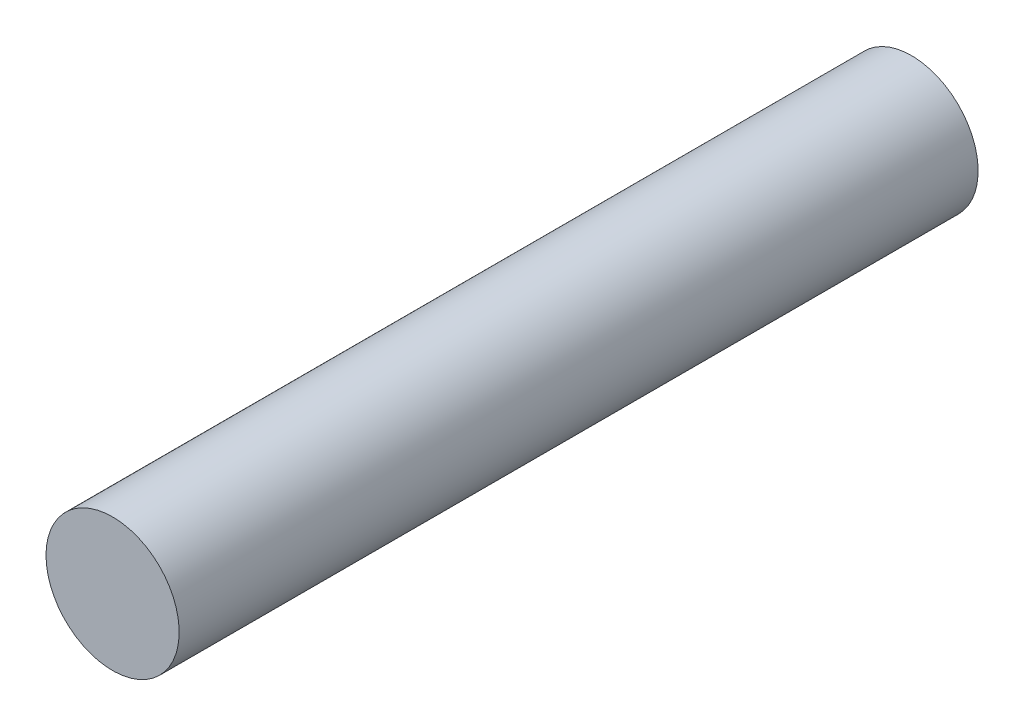
ISO-10303-21;
HEADER;
FILE_DESCRIPTION(('STEP AP214'),'2;1');
FILE_NAME('part.step','',(''),(''),'','','');
FILE_SCHEMA(('AUTOMOTIVE_DESIGN { 1 0 10303 214 1 1 1 1 }'));
ENDSEC;
DATA;
#1=APPLICATION_CONTEXT('core data for automotive mechanical design processes');
#2=APPLICATION_PROTOCOL_DEFINITION('international standard','automotive_design',2000,#1);
#3=PRODUCT_CONTEXT('',#1,'mechanical');
#4=PRODUCT('Part','Part','',(#3));
#5=PRODUCT_RELATED_PRODUCT_CATEGORY('part','',(#4));
#6=PRODUCT_DEFINITION_FORMATION('','',#4);
#7=PRODUCT_DEFINITION_CONTEXT('part definition',#1,'design');
#8=PRODUCT_DEFINITION('design','',#6,#7);
#9=PRODUCT_DEFINITION_SHAPE('','',#8);
#10=(LENGTH_UNIT() NAMED_UNIT(*) SI_UNIT(.MILLI.,.METRE.));
#11=(NAMED_UNIT(*) PLANE_ANGLE_UNIT() SI_UNIT($,.RADIAN.));
#12=(NAMED_UNIT(*) SI_UNIT($,.STERADIAN.) SOLID_ANGLE_UNIT());
#13=UNCERTAINTY_MEASURE_WITH_UNIT(LENGTH_MEASURE(1.E-05),#10,'distance_accuracy_value','');
#14=(GEOMETRIC_REPRESENTATION_CONTEXT(3) GLOBAL_UNCERTAINTY_ASSIGNED_CONTEXT((#13)) GLOBAL_UNIT_ASSIGNED_CONTEXT((#10,
#11,#12)) REPRESENTATION_CONTEXT('',''));
#15=CARTESIAN_POINT('',(0.,0.,0.));
#16=DIRECTION('',(0.,0.,1.));
#17=DIRECTION('',(1.,0.,0.));
#18=AXIS2_PLACEMENT_3D('',#15,#16,#17);
#19=CARTESIAN_POINT('',(0.,0.,152.4));
#20=DIRECTION('',(0.,0.,-1.));
#21=DIRECTION('',(-1.,0.,0.));
#22=AXIS2_PLACEMENT_3D('',#19,#20,#21);
#23=CYLINDRICAL_SURFACE('',#22,12.7);
#24=CARTESIAN_POINT('',(0.,0.,152.4));
#25=DIRECTION('',(0.,0.,1.));
#26=DIRECTION('',(1.,0.,0.));
#27=AXIS2_PLACEMENT_3D('',#24,#25,#26);
#28=CIRCLE('',#27,12.7);
#29=CARTESIAN_POINT('',(-12.7,0.,152.4));
#30=VERTEX_POINT('',#29);
#31=EDGE_CURVE('E10',#30,#30,#28,.T.);
#32=CARTESIAN_POINT('',(0.,0.,0.));
#33=DIRECTION('',(0.,0.,1.));
#34=DIRECTION('',(1.,0.,0.));
#35=AXIS2_PLACEMENT_3D('',#32,#33,#34);
#36=CIRCLE('',#35,12.7);
#37=CARTESIAN_POINT('',(-12.7,0.,0.));
#38=VERTEX_POINT('',#37);
#39=EDGE_CURVE('E34',#38,#38,#36,.T.);
#40=CARTESIAN_POINT('',(-12.7,0.,152.4));
#41=CARTESIAN_POINT('',(-12.7,0.,150.8125));
#42=CARTESIAN_POINT('',(-12.7,0.,149.225));
#43=CARTESIAN_POINT('',(-12.7,0.,146.05));
#44=CARTESIAN_POINT('',(-12.7,0.,144.4625));
#45=CARTESIAN_POINT('',(-12.7,0.,141.2875));
#46=CARTESIAN_POINT('',(-12.7,0.,139.7));
#47=CARTESIAN_POINT('',(-12.7,0.,136.525));
#48=CARTESIAN_POINT('',(-12.7,0.,134.9375));
#49=CARTESIAN_POINT('',(-12.7,0.,131.7625));
#50=CARTESIAN_POINT('',(-12.7,0.,130.175));
#51=CARTESIAN_POINT('',(-12.7,0.,127.));
#52=CARTESIAN_POINT('',(-12.7,0.,125.4125));
#53=CARTESIAN_POINT('',(-12.7,0.,122.2375));
#54=CARTESIAN_POINT('',(-12.7,0.,120.65));
#55=CARTESIAN_POINT('',(-12.7,0.,117.475));
#56=CARTESIAN_POINT('',(-12.7,0.,115.8875));
#57=CARTESIAN_POINT('',(-12.7,0.,112.7125));
#58=CARTESIAN_POINT('',(-12.7,0.,111.125));
#59=CARTESIAN_POINT('',(-12.7,0.,107.95));
#60=CARTESIAN_POINT('',(-12.7,0.,106.3625));
#61=CARTESIAN_POINT('',(-12.7,0.,103.1875));
#62=CARTESIAN_POINT('',(-12.7,0.,101.6));
#63=CARTESIAN_POINT('',(-12.7,0.,98.425));
#64=CARTESIAN_POINT('',(-12.7,0.,96.8375));
#65=CARTESIAN_POINT('',(-12.7,0.,93.6625));
#66=CARTESIAN_POINT('',(-12.7,0.,92.075));
#67=CARTESIAN_POINT('',(-12.7,0.,88.9));
#68=CARTESIAN_POINT('',(-12.7,0.,87.3125));
#69=CARTESIAN_POINT('',(-12.7,0.,84.1375));
#70=CARTESIAN_POINT('',(-12.7,0.,82.55));
#71=CARTESIAN_POINT('',(-12.7,0.,79.375));
#72=CARTESIAN_POINT('',(-12.7,0.,77.7875));
#73=CARTESIAN_POINT('',(-12.7,0.,74.6125));
#74=CARTESIAN_POINT('',(-12.7,0.,73.025));
#75=CARTESIAN_POINT('',(-12.7,0.,69.85));
#76=CARTESIAN_POINT('',(-12.7,0.,68.2625));
#77=CARTESIAN_POINT('',(-12.7,0.,65.0875));
#78=CARTESIAN_POINT('',(-12.7,0.,63.5));
#79=CARTESIAN_POINT('',(-12.7,0.,60.325));
#80=CARTESIAN_POINT('',(-12.7,0.,58.7375));
#81=CARTESIAN_POINT('',(-12.7,0.,55.5625));
#82=CARTESIAN_POINT('',(-12.7,0.,53.975));
#83=CARTESIAN_POINT('',(-12.7,0.,50.8));
#84=CARTESIAN_POINT('',(-12.7,0.,49.2125));
#85=CARTESIAN_POINT('',(-12.7,0.,46.0375));
#86=CARTESIAN_POINT('',(-12.7,0.,44.45));
#87=CARTESIAN_POINT('',(-12.7,0.,41.275));
#88=CARTESIAN_POINT('',(-12.7,0.,39.6875));
#89=CARTESIAN_POINT('',(-12.7,0.,36.5125));
#90=CARTESIAN_POINT('',(-12.7,0.,34.925));
#91=CARTESIAN_POINT('',(-12.7,0.,31.75));
#92=CARTESIAN_POINT('',(-12.7,0.,30.1625));
#93=CARTESIAN_POINT('',(-12.7,0.,26.9875));
#94=CARTESIAN_POINT('',(-12.7,0.,25.4));
#95=CARTESIAN_POINT('',(-12.7,0.,22.225));
#96=CARTESIAN_POINT('',(-12.7,0.,20.6375));
#97=CARTESIAN_POINT('',(-12.7,0.,17.4625));
#98=CARTESIAN_POINT('',(-12.7,0.,15.875));
#99=CARTESIAN_POINT('',(-12.7,0.,12.7));
#100=CARTESIAN_POINT('',(-12.7,0.,11.1125));
#101=CARTESIAN_POINT('',(-12.7,0.,7.93750000000001));
#102=CARTESIAN_POINT('',(-12.7,0.,6.35));
#103=CARTESIAN_POINT('',(-12.7,0.,3.175));
#104=CARTESIAN_POINT('',(-12.7,0.,1.5875));
#105=CARTESIAN_POINT('',(-12.7,0.,0.));
#106=B_SPLINE_CURVE_WITH_KNOTS('',3,(#40,#41,#42,#43,#44,#45,#46,#47,#48,#49,#50,#51,#52,#53,
#54,#55,#56,#57,#58,#59,#60,#61,#62,#63,#64,#65,#66,#67,#68,#69,#70,#71,#72,#73,#74,#75,#76,#77,
#78,#79,#80,#81,#82,#83,#84,#85,#86,#87,#88,#89,#90,#91,#92,#93,#94,#95,#96,#97,#98,#99,#100,
#101,#102,#103,#104,#105),.UNSPECIFIED.,.F.,.F.,(4,2,2,2,2,2,2,2,2,2,2,2,2,2,2,2,2,2,2,2,2,2,2,
2,2,2,2,2,2,2,2,2,4),(0.,4.76249999999998,9.52499999999998,14.2875,19.05,23.8125,28.575,33.3375,
38.1,42.8625,47.625,52.3875,57.15,61.9125,66.675,71.4375,76.2,80.9625,85.725,90.4875,95.25,
100.0125,104.775,109.5375,114.3,119.0625,123.825,128.5875,133.35,138.1125,142.875,147.6375,
152.4),.UNSPECIFIED.);
#107=EDGE_CURVE('BSEAM31',#30,#38,#106,.T.);
#108=ORIENTED_EDGE('',*,*,#31,.F.);
#109=ORIENTED_EDGE('',*,*,#39,.T.);
#110=ORIENTED_EDGE('',*,*,#107,.T.);
#111=ORIENTED_EDGE('',*,*,#107,.F.);
#112=EDGE_LOOP('',(#108,#110,#109,#111));
#113=FACE_BOUND('',#112,.T.);
#114=ADVANCED_FACE('F31',(#113),#23,.T.);
#115=CARTESIAN_POINT('',(0.,0.,152.4));
#116=DIRECTION('',(0.,0.,1.));
#117=DIRECTION('',(1.,0.,0.));
#118=AXIS2_PLACEMENT_3D('',#115,#116,#117);
#119=PLANE('',#118);
#120=ORIENTED_EDGE('',*,*,#31,.T.);
#121=EDGE_LOOP('',(#120));
#122=FACE_BOUND('',#121,.T.);
#123=ADVANCED_FACE('F46',(#122),#119,.T.);
#124=CARTESIAN_POINT('',(0.,0.,0.));
#125=DIRECTION('',(0.,0.,1.));
#126=DIRECTION('',(1.,0.,0.));
#127=AXIS2_PLACEMENT_3D('',#124,#125,#126);
#128=PLANE('',#127);
#129=ORIENTED_EDGE('',*,*,#39,.F.);
#130=EDGE_LOOP('',(#129));
#131=FACE_BOUND('',#130,.T.);
#132=ADVANCED_FACE('F44',(#131),#128,.F.);
#133=CLOSED_SHELL('',(#114,#123,#132));
#134=MANIFOLD_SOLID_BREP('B2',#133);
#135=ADVANCED_BREP_SHAPE_REPRESENTATION('',(#18,#134),#14);
#136=SHAPE_DEFINITION_REPRESENTATION(#9,#135);
ENDSEC;
END-ISO-10303-21;
